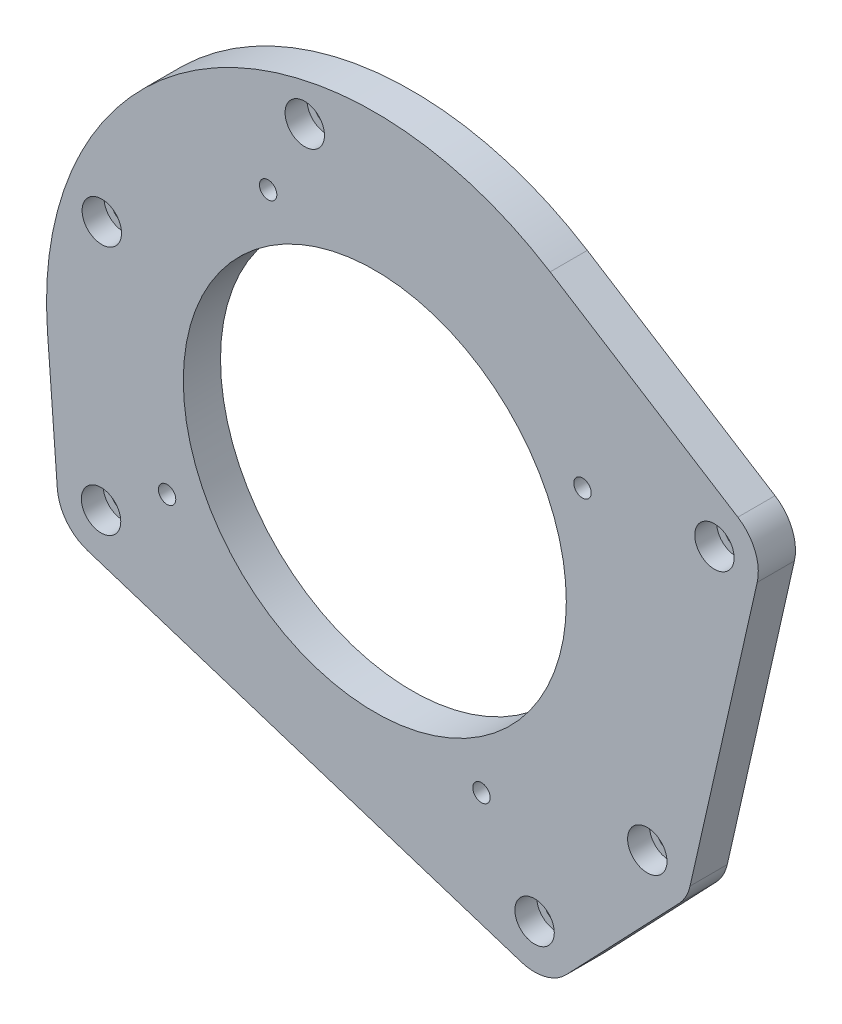
ISO-10303-21;
HEADER;
FILE_DESCRIPTION(('STEP AP214'),'2;1');
FILE_NAME('part.step','',(''),(''),'','','');
FILE_SCHEMA(('AUTOMOTIVE_DESIGN { 1 0 10303 214 1 1 1 1 }'));
ENDSEC;
DATA;
#1=APPLICATION_CONTEXT('core data for automotive mechanical design processes');
#2=APPLICATION_PROTOCOL_DEFINITION('international standard','automotive_design',2000,#1);
#3=PRODUCT_CONTEXT('',#1,'mechanical');
#4=PRODUCT('Part','Part','',(#3));
#5=PRODUCT_RELATED_PRODUCT_CATEGORY('part','',(#4));
#6=PRODUCT_DEFINITION_FORMATION('','',#4);
#7=PRODUCT_DEFINITION_CONTEXT('part definition',#1,'design');
#8=PRODUCT_DEFINITION('design','',#6,#7);
#9=PRODUCT_DEFINITION_SHAPE('','',#8);
#10=(LENGTH_UNIT() NAMED_UNIT(*) SI_UNIT(.MILLI.,.METRE.));
#11=(NAMED_UNIT(*) PLANE_ANGLE_UNIT() SI_UNIT($,.RADIAN.));
#12=(NAMED_UNIT(*) SI_UNIT($,.STERADIAN.) SOLID_ANGLE_UNIT());
#13=UNCERTAINTY_MEASURE_WITH_UNIT(LENGTH_MEASURE(1.E-05),#10,'distance_accuracy_value','');
#14=(GEOMETRIC_REPRESENTATION_CONTEXT(3) GLOBAL_UNCERTAINTY_ASSIGNED_CONTEXT((#13)) GLOBAL_UNIT_ASSIGNED_CONTEXT((#10,
#11,#12)) REPRESENTATION_CONTEXT('',''));
#15=CARTESIAN_POINT('',(0.,0.,0.));
#16=DIRECTION('',(0.,0.,1.));
#17=DIRECTION('',(1.,0.,0.));
#18=AXIS2_PLACEMENT_3D('',#15,#16,#17);
#19=CARTESIAN_POINT('',(119.470310769494,-114.064414744749,17.));
#20=DIRECTION('',(-0.723281238147046,0.690553582674419,0.));
#21=DIRECTION('',(-0.690553582674419,-0.723281238147046,0.));
#22=AXIS2_PLACEMENT_3D('',#19,#20,#21);
#23=PLANE('',#22);
#24=DIRECTION('',(0.690553582674419,0.723281238147046,0.));
#25=VECTOR('',#24,1.);
#26=CARTESIAN_POINT('',(119.470310769494,-114.064414744749,0.));
#27=LINE('',#26,#25);
#28=CARTESIAN_POINT('',(87.4941780013985,-147.556003927578,0.));
#29=VERTEX_POINT('',#28);
#30=CARTESIAN_POINT('',(138.99417800116,-93.6152458184964,0.));
#31=VERTEX_POINT('',#30);
#32=EDGE_CURVE('E148',#29,#31,#27,.T.);
#33=ORIENTED_EDGE('',*,*,#32,.T.);
#34=DIRECTION('',(0.,0.,-1.));
#35=VECTOR('',#34,1.);
#36=CARTESIAN_POINT('',(138.99417800116,-93.6152458184964,17.));
#37=LINE('',#36,#35);
#38=CARTESIAN_POINT('',(138.99417800116,-93.6152458184964,17.));
#39=VERTEX_POINT('',#38);
#40=EDGE_CURVE('E11',#39,#31,#37,.T.);
#41=ORIENTED_EDGE('',*,*,#40,.F.);
#42=DIRECTION('',(0.690553582674419,0.723281238147046,0.));
#43=VECTOR('',#42,1.);
#44=CARTESIAN_POINT('',(119.470310769494,-114.064414744749,17.));
#45=LINE('',#44,#43);
#46=CARTESIAN_POINT('',(87.4941780013985,-147.556003927578,17.));
#47=VERTEX_POINT('',#46);
#48=EDGE_CURVE('E220',#47,#39,#45,.T.);
#49=ORIENTED_EDGE('',*,*,#48,.F.);
#50=DIRECTION('',(0.,0.,-1.));
#51=VECTOR('',#50,1.);
#52=CARTESIAN_POINT('',(87.4941780013985,-147.556003927578,17.));
#53=LINE('',#52,#51);
#54=EDGE_CURVE('E141',#47,#29,#53,.T.);
#55=ORIENTED_EDGE('',*,*,#54,.T.);
#56=EDGE_LOOP('',(#33,#41,#49,#55));
#57=FACE_BOUND('',#56,.T.);
#58=ADVANCED_FACE('F37',(#57),#23,.F.);
#59=CARTESIAN_POINT('',(124.500000000623,-79.7769129290198,17.));
#60=DIRECTION('',(0.,0.,-1.));
#61=DIRECTION('',(-1.,0.,0.));
#62=AXIS2_PLACEMENT_3D('',#59,#60,#61);
#63=CYLINDRICAL_SURFACE('',#62,20.0394773652214);
#64=CARTESIAN_POINT('',(124.500000000623,-79.7769129290198,0.));
#65=DIRECTION('',(0.,0.,1.));
#66=DIRECTION('',(1.,0.,0.));
#67=AXIS2_PLACEMENT_3D('',#64,#65,#66);
#68=CIRCLE('',#67,20.0394773652214);
#69=CARTESIAN_POINT('',(144.044882633008,-84.2016407124546,0.));
#70=VERTEX_POINT('',#69);
#71=EDGE_CURVE('E152',#31,#70,#68,.T.);
#72=ORIENTED_EDGE('',*,*,#71,.T.);
#73=DIRECTION('',(0.,0.,-1.));
#74=VECTOR('',#73,1.);
#75=CARTESIAN_POINT('',(144.044882633008,-84.2016407124546,17.));
#76=LINE('',#75,#74);
#77=CARTESIAN_POINT('',(144.044882633008,-84.2016407124546,17.));
#78=VERTEX_POINT('',#77);
#79=EDGE_CURVE('E46',#78,#70,#76,.T.);
#80=ORIENTED_EDGE('',*,*,#79,.F.);
#81=CARTESIAN_POINT('',(124.500000000623,-79.7769129290198,17.));
#82=DIRECTION('',(0.,0.,1.));
#83=DIRECTION('',(1.,0.,0.));
#84=AXIS2_PLACEMENT_3D('',#81,#82,#83);
#85=CIRCLE('',#84,20.0394773652214);
#86=EDGE_CURVE('E103',#39,#78,#85,.T.);
#87=ORIENTED_EDGE('',*,*,#86,.F.);
#88=ORIENTED_EDGE('',*,*,#40,.T.);
#89=EDGE_LOOP('',(#72,#80,#87,#88));
#90=FACE_BOUND('',#89,.T.);
#91=ADVANCED_FACE('F190',(#90),#63,.T.);
#92=CARTESIAN_POINT('',(155.155184264045,-35.1252789525328,17.));
#93=DIRECTION('',(0.975318980439363,-0.220800557958355,0.));
#94=DIRECTION('',(0.220800557958355,0.975318980439363,0.));
#95=AXIS2_PLACEMENT_3D('',#92,#93,#94);
#96=PLANE('',#95);
#97=DIRECTION('',(-0.220800557958355,-0.975318980439363,0.));
#98=VECTOR('',#97,1.);
#99=CARTESIAN_POINT('',(155.155184264045,-35.1252789525328,0.));
#100=LINE('',#99,#98);
#101=CARTESIAN_POINT('',(174.718661168987,51.2904009950494,0.));
#102=VERTEX_POINT('',#101);
#103=EDGE_CURVE('E155',#102,#70,#100,.T.);
#104=ORIENTED_EDGE('',*,*,#103,.F.);
#105=DIRECTION('',(0.,0.,-1.));
#106=VECTOR('',#105,1.);
#107=CARTESIAN_POINT('',(174.718661168987,51.2904009950494,17.));
#108=LINE('',#107,#106);
#109=CARTESIAN_POINT('',(174.718661168987,51.2904009950494,17.));
#110=VERTEX_POINT('',#109);
#111=EDGE_CURVE('E183',#110,#102,#108,.T.);
#112=ORIENTED_EDGE('',*,*,#111,.F.);
#113=DIRECTION('',(-0.220800557958355,-0.975318980439363,0.));
#114=VECTOR('',#113,1.);
#115=CARTESIAN_POINT('',(155.155184264045,-35.1252789525328,17.));
#116=LINE('',#115,#114);
#117=EDGE_CURVE('E189',#110,#78,#116,.T.);
#118=ORIENTED_EDGE('',*,*,#117,.T.);
#119=ORIENTED_EDGE('',*,*,#79,.T.);
#120=EDGE_LOOP('',(#104,#112,#118,#119));
#121=FACE_BOUND('',#120,.T.);
#122=ADVANCED_FACE('F187',(#121),#96,.T.);
#123=CARTESIAN_POINT('',(155.173778536602,55.7151287784843,17.));
#124=DIRECTION('',(0.,0.,-1.));
#125=DIRECTION('',(-1.,0.,0.));
#126=AXIS2_PLACEMENT_3D('',#123,#124,#125);
#127=CYLINDRICAL_SURFACE('',#126,20.0394773652212);
#128=CARTESIAN_POINT('',(155.173778536602,55.7151287784843,0.));
#129=DIRECTION('',(0.,0.,1.));
#130=DIRECTION('',(1.,0.,0.));
#131=AXIS2_PLACEMENT_3D('',#128,#129,#130);
#132=CIRCLE('',#131,20.0394773652212);
#133=CARTESIAN_POINT('',(165.87343122716,72.6590977755238,0.));
#134=VERTEX_POINT('',#133);
#135=EDGE_CURVE('E158',#102,#134,#132,.T.);
#136=ORIENTED_EDGE('',*,*,#135,.T.);
#137=DIRECTION('',(0.,0.,-1.));
#138=VECTOR('',#137,1.);
#139=CARTESIAN_POINT('',(165.87343122716,72.6590977755238,17.));
#140=LINE('',#139,#138);
#141=CARTESIAN_POINT('',(165.87343122716,72.6590977755238,17.));
#142=VERTEX_POINT('',#141);
#143=EDGE_CURVE('E180',#142,#134,#140,.T.);
#144=ORIENTED_EDGE('',*,*,#143,.F.);
#145=CARTESIAN_POINT('',(155.173778536602,55.7151287784843,17.));
#146=DIRECTION('',(0.,0.,1.));
#147=DIRECTION('',(1.,0.,0.));
#148=AXIS2_PLACEMENT_3D('',#145,#146,#147);
#149=CIRCLE('',#148,20.0394773652212);
#150=EDGE_CURVE('E209',#110,#142,#149,.T.);
#151=ORIENTED_EDGE('',*,*,#150,.F.);
#152=ORIENTED_EDGE('',*,*,#111,.T.);
#153=EDGE_LOOP('',(#136,#144,#151,#152));
#154=FACE_BOUND('',#153,.T.);
#155=ADVANCED_FACE('F200',(#154),#127,.T.);
#156=CARTESIAN_POINT('',(80.0893094332477,126.829422905356,17.));
#157=DIRECTION('',(-0.533928729554984,-0.845529486035703,0.));
#158=DIRECTION('',(0.845529486035703,-0.533928729554984,0.));
#159=AXIS2_PLACEMENT_3D('',#156,#157,#158);
#160=PLANE('',#159);
#161=DIRECTION('',(-0.845529486035703,0.533928729554985,0.));
#162=VECTOR('',#161,1.);
#163=CARTESIAN_POINT('',(80.0893094332477,126.829422905356,0.));
#164=LINE('',#163,#162);
#165=CARTESIAN_POINT('',(80.0893094332478,126.829422905356,0.));
#166=VERTEX_POINT('',#165);
#167=EDGE_CURVE('E160',#134,#166,#164,.T.);
#168=ORIENTED_EDGE('',*,*,#167,.T.);
#169=DIRECTION('',(0.,0.,-1.));
#170=VECTOR('',#169,1.);
#171=CARTESIAN_POINT('',(80.0893094332478,126.829422905356,17.));
#172=LINE('',#171,#170);
#173=CARTESIAN_POINT('',(80.0893094332478,126.829422905356,17.));
#174=VERTEX_POINT('',#173);
#175=EDGE_CURVE('E177',#174,#166,#172,.T.);
#176=ORIENTED_EDGE('',*,*,#175,.F.);
#177=DIRECTION('',(-0.845529486035703,0.533928729554985,0.));
#178=VECTOR('',#177,1.);
#179=CARTESIAN_POINT('',(80.0893094332477,126.829422905356,17.));
#180=LINE('',#179,#178);
#181=EDGE_CURVE('E206',#142,#174,#180,.T.);
#182=ORIENTED_EDGE('',*,*,#181,.F.);
#183=ORIENTED_EDGE('',*,*,#143,.T.);
#184=EDGE_LOOP('',(#168,#176,#182,#183));
#185=FACE_BOUND('',#184,.T.);
#186=ADVANCED_FACE('F204',(#185),#160,.F.);
#187=CARTESIAN_POINT('',(1.00092271023011E-13,1.52643785721383E-13,17.));
#188=DIRECTION('',(0.,0.,-1.));
#189=DIRECTION('',(-1.,0.,0.));
#190=AXIS2_PLACEMENT_3D('',#187,#188,#189);
#191=CYLINDRICAL_SURFACE('',#190,150.);
#192=CARTESIAN_POINT('',(1.00092271023011E-13,1.52643785721383E-13,0.));
#193=DIRECTION('',(0.,0.,1.));
#194=DIRECTION('',(1.,0.,0.));
#195=AXIS2_PLACEMENT_3D('',#192,#193,#194);
#196=CIRCLE('',#195,150.);
#197=CARTESIAN_POINT('',(-149.578321741435,-11.239469071788,0.));
#198=VERTEX_POINT('',#197);
#199=EDGE_CURVE('E162',#166,#198,#196,.T.);
#200=ORIENTED_EDGE('',*,*,#199,.T.);
#201=DIRECTION('',(0.,0.,-1.));
#202=VECTOR('',#201,1.);
#203=CARTESIAN_POINT('',(-149.578321741435,-11.239469071788,17.));
#204=LINE('',#203,#202);
#205=CARTESIAN_POINT('',(-149.578321741435,-11.239469071788,17.));
#206=VERTEX_POINT('',#205);
#207=EDGE_CURVE('E175',#206,#198,#204,.T.);
#208=ORIENTED_EDGE('',*,*,#207,.F.);
#209=CARTESIAN_POINT('',(1.00092271023011E-13,1.52643785721383E-13,17.));
#210=DIRECTION('',(0.,0.,1.));
#211=DIRECTION('',(1.,0.,0.));
#212=AXIS2_PLACEMENT_3D('',#209,#210,#211);
#213=CIRCLE('',#212,150.);
#214=EDGE_CURVE('E208',#174,#206,#213,.T.);
#215=ORIENTED_EDGE('',*,*,#214,.F.);
#216=ORIENTED_EDGE('',*,*,#175,.T.);
#217=EDGE_LOOP('',(#200,#208,#215,#216));
#218=FACE_BOUND('',#217,.T.);
#219=ADVANCED_FACE('F245',(#218),#191,.T.);
#220=CARTESIAN_POINT('',(-149.578321741435,-11.2394690717881,17.));
#221=DIRECTION('',(-0.997188811609568,-0.0749297938119206,0.));
#222=DIRECTION('',(0.0749297938119206,-0.997188811609568,0.));
#223=AXIS2_PLACEMENT_3D('',#220,#221,#222);
#224=PLANE('',#223);
#225=DIRECTION('',(-0.0749297938119206,0.997188811609568,0.));
#226=VECTOR('',#225,1.);
#227=CARTESIAN_POINT('',(-149.578321741435,-11.2394690717881,0.));
#228=LINE('',#227,#226);
#229=CARTESIAN_POINT('',(-145.046651368306,-71.5483364007124,0.));
#230=VERTEX_POINT('',#229);
#231=EDGE_CURVE('E165',#230,#198,#228,.T.);
#232=ORIENTED_EDGE('',*,*,#231,.F.);
#233=DIRECTION('',(0.,0.,-1.));
#234=VECTOR('',#233,1.);
#235=CARTESIAN_POINT('',(-145.046651368306,-71.5483364007124,17.));
#236=LINE('',#235,#234);
#237=CARTESIAN_POINT('',(-145.046651368306,-71.5483364007124,17.));
#238=VERTEX_POINT('',#237);
#239=EDGE_CURVE('E136',#238,#230,#236,.T.);
#240=ORIENTED_EDGE('',*,*,#239,.F.);
#241=DIRECTION('',(-0.0749297938119206,0.997188811609568,0.));
#242=VECTOR('',#241,1.);
#243=CARTESIAN_POINT('',(-149.578321741435,-11.2394690717881,17.));
#244=LINE('',#243,#242);
#245=EDGE_CURVE('E129',#238,#206,#244,.T.);
#246=ORIENTED_EDGE('',*,*,#245,.T.);
#247=ORIENTED_EDGE('',*,*,#207,.T.);
#248=EDGE_LOOP('',(#232,#240,#246,#247));
#249=FACE_BOUND('',#248,.T.);
#250=ADVANCED_FACE('F216',(#249),#224,.T.);
#251=CARTESIAN_POINT('',(-125.063508749204,-70.0467824936377,17.));
#252=DIRECTION('',(0.,0.,-1.));
#253=DIRECTION('',(-1.,0.,0.));
#254=AXIS2_PLACEMENT_3D('',#251,#252,#253);
#255=CYLINDRICAL_SURFACE('',#254,20.0394773652213);
#256=CARTESIAN_POINT('',(-125.063508749204,-70.0467824936377,0.));
#257=DIRECTION('',(0.,0.,1.));
#258=DIRECTION('',(1.,0.,0.));
#259=AXIS2_PLACEMENT_3D('',#256,#257,#258);
#260=CIRCLE('',#259,20.0394773652213);
#261=CARTESIAN_POINT('',(-131.196437849904,-89.1247235176846,0.));
#262=VERTEX_POINT('',#261);
#263=EDGE_CURVE('E135',#230,#262,#260,.T.);
#264=ORIENTED_EDGE('',*,*,#263,.T.);
#265=DIRECTION('',(0.,0.,-1.));
#266=VECTOR('',#265,1.);
#267=CARTESIAN_POINT('',(-131.196437849904,-89.1247235176846,17.));
#268=LINE('',#267,#266);
#269=CARTESIAN_POINT('',(-131.196437849904,-89.1247235176846,17.));
#270=VERTEX_POINT('',#269);
#271=EDGE_CURVE('E132',#270,#262,#268,.T.);
#272=ORIENTED_EDGE('',*,*,#271,.F.);
#273=CARTESIAN_POINT('',(-125.063508749204,-70.0467824936377,17.));
#274=DIRECTION('',(0.,0.,1.));
#275=DIRECTION('',(1.,0.,0.));
#276=AXIS2_PLACEMENT_3D('',#273,#274,#275);
#277=CIRCLE('',#276,20.0394773652213);
#278=EDGE_CURVE('E123',#238,#270,#277,.T.);
#279=ORIENTED_EDGE('',*,*,#278,.F.);
#280=ORIENTED_EDGE('',*,*,#239,.T.);
#281=EDGE_LOOP('',(#264,#272,#279,#280));
#282=FACE_BOUND('',#281,.T.);
#283=ADVANCED_FACE('F133',(#282),#255,.T.);
#284=CARTESIAN_POINT('',(-38.2552959648493,-119.002236662349,17.));
#285=DIRECTION('',(0.306042367718795,0.952017893298794,0.));
#286=DIRECTION('',(-0.952017893298794,0.306042367718795,0.));
#287=AXIS2_PLACEMENT_3D('',#284,#285,#286);
#288=PLANE('',#287);
#289=DIRECTION('',(0.952017893298794,-0.306042367718795,0.));
#290=VECTOR('',#289,1.);
#291=CARTESIAN_POINT('',(-38.2552959648493,-119.002236662349,0.));
#292=LINE('',#291,#290);
#293=CARTESIAN_POINT('',(66.867070900162,-152.795612062148,0.));
#294=VERTEX_POINT('',#293);
#295=EDGE_CURVE('E89',#262,#294,#292,.T.);
#296=ORIENTED_EDGE('',*,*,#295,.T.);
#297=DIRECTION('',(0.,0.,-1.));
#298=VECTOR('',#297,1.);
#299=CARTESIAN_POINT('',(66.867070900162,-152.795612062148,17.));
#300=LINE('',#299,#298);
#301=CARTESIAN_POINT('',(66.867070900162,-152.795612062148,17.));
#302=VERTEX_POINT('',#301);
#303=EDGE_CURVE('E137',#302,#294,#300,.T.);
#304=ORIENTED_EDGE('',*,*,#303,.F.);
#305=DIRECTION('',(0.952017893298794,-0.306042367718795,0.));
#306=VECTOR('',#305,1.);
#307=CARTESIAN_POINT('',(-38.2552959648493,-119.002236662349,17.));
#308=LINE('',#307,#306);
#309=EDGE_CURVE('E127',#270,#302,#308,.T.);
#310=ORIENTED_EDGE('',*,*,#309,.F.);
#311=ORIENTED_EDGE('',*,*,#271,.T.);
#312=EDGE_LOOP('',(#296,#304,#310,#311));
#313=FACE_BOUND('',#312,.T.);
#314=ADVANCED_FACE('F139',(#313),#288,.F.);
#315=CARTESIAN_POINT('',(1.00092271023011E-13,1.52643785721383E-13,17.));
#316=DIRECTION('',(0.,0.,-1.));
#317=DIRECTION('',(-1.,0.,0.));
#318=AXIS2_PLACEMENT_3D('',#315,#316,#317);
#319=CYLINDRICAL_SURFACE('',#318,87.5);
#320=CARTESIAN_POINT('',(1.00092271023011E-13,1.52643785721383E-13,17.));
#321=DIRECTION('',(0.,0.,1.));
#322=DIRECTION('',(1.,0.,0.));
#323=AXIS2_PLACEMENT_3D('',#320,#321,#322);
#324=CIRCLE('',#323,87.5);
#325=CARTESIAN_POINT('',(87.5000000000001,1.52643785721383E-13,17.));
#326=VERTEX_POINT('',#325);
#327=EDGE_CURVE('E171',#326,#326,#324,.T.);
#328=ORIENTED_EDGE('',*,*,#327,.T.);
#329=EDGE_LOOP('',(#328));
#330=FACE_BOUND('',#329,.T.);
#331=CARTESIAN_POINT('',(1.00092271023011E-13,1.52643785721383E-13,0.));
#332=DIRECTION('',(0.,0.,1.));
#333=DIRECTION('',(1.,0.,0.));
#334=AXIS2_PLACEMENT_3D('',#331,#332,#333);
#335=CIRCLE('',#334,87.5);
#336=CARTESIAN_POINT('',(87.5000000000001,1.52643785721383E-13,0.));
#337=VERTEX_POINT('',#336);
#338=EDGE_CURVE('E145',#337,#337,#335,.T.);
#339=ORIENTED_EDGE('',*,*,#338,.F.);
#340=EDGE_LOOP('',(#339));
#341=FACE_BOUND('',#340,.T.);
#342=ADVANCED_FACE('F39',(#330,#341),#319,.F.);
#343=CARTESIAN_POINT('',(73.0000000008615,-133.717671038101,17.));
#344=DIRECTION('',(0.,0.,-1.));
#345=DIRECTION('',(-1.,0.,0.));
#346=AXIS2_PLACEMENT_3D('',#343,#344,#345);
#347=CYLINDRICAL_SURFACE('',#346,20.0394773652213);
#348=CARTESIAN_POINT('',(73.0000000008615,-133.717671038101,0.));
#349=DIRECTION('',(0.,0.,1.));
#350=DIRECTION('',(1.,0.,0.));
#351=AXIS2_PLACEMENT_3D('',#348,#349,#350);
#352=CIRCLE('',#351,20.0394773652213);
#353=EDGE_CURVE('E95',#294,#29,#352,.T.);
#354=ORIENTED_EDGE('',*,*,#353,.T.);
#355=ORIENTED_EDGE('',*,*,#54,.F.);
#356=CARTESIAN_POINT('',(73.0000000008615,-133.717671038101,17.));
#357=DIRECTION('',(0.,0.,1.));
#358=DIRECTION('',(1.,0.,0.));
#359=AXIS2_PLACEMENT_3D('',#356,#357,#358);
#360=CIRCLE('',#359,20.0394773652213);
#361=EDGE_CURVE('E54',#302,#47,#360,.T.);
#362=ORIENTED_EDGE('',*,*,#361,.F.);
#363=ORIENTED_EDGE('',*,*,#303,.T.);
#364=EDGE_LOOP('',(#354,#355,#362,#363));
#365=FACE_BOUND('',#364,.T.);
#366=ADVANCED_FACE('F221',(#365),#347,.T.);
#367=CARTESIAN_POINT('',(0.,0.,17.));
#368=DIRECTION('',(0.,0.,1.));
#369=DIRECTION('',(1.,0.,0.));
#370=AXIS2_PLACEMENT_3D('',#367,#368,#369);
#371=PLANE('',#370);
#372=CARTESIAN_POINT('',(-48.728615608265,94.9007082212808,17.));
#373=DIRECTION('',(0.,0.,1.));
#374=DIRECTION('',(1.,0.,0.));
#375=AXIS2_PLACEMENT_3D('',#372,#373,#374);
#376=CIRCLE('',#375,3.96874999999999);
#377=CARTESIAN_POINT('',(-44.759865608265,94.9007082212808,17.));
#378=VERTEX_POINT('',#377);
#379=EDGE_CURVE('E517',#378,#378,#376,.T.);
#380=ORIENTED_EDGE('',*,*,#379,.F.);
#381=EDGE_LOOP('',(#380));
#382=FACE_BOUND('',#381,.T.);
#383=CARTESIAN_POINT('',(94.9007082212915,48.7286156082705,17.));
#384=DIRECTION('',(0.,0.,1.));
#385=DIRECTION('',(1.,0.,0.));
#386=AXIS2_PLACEMENT_3D('',#383,#384,#385);
#387=CIRCLE('',#386,3.96874999999999);
#388=CARTESIAN_POINT('',(98.8694582212915,48.7286156082705,17.));
#389=VERTEX_POINT('',#388);
#390=EDGE_CURVE('E519',#389,#389,#387,.T.);
#391=ORIENTED_EDGE('',*,*,#390,.F.);
#392=EDGE_LOOP('',(#391));
#393=FACE_BOUND('',#392,.T.);
#394=CARTESIAN_POINT('',(48.7286156082812,-94.900708221286,17.));
#395=DIRECTION('',(0.,0.,1.));
#396=DIRECTION('',(1.,0.,0.));
#397=AXIS2_PLACEMENT_3D('',#394,#395,#396);
#398=CIRCLE('',#397,3.96874999999999);
#399=CARTESIAN_POINT('',(52.6973656082812,-94.900708221286,17.));
#400=VERTEX_POINT('',#399);
#401=EDGE_CURVE('E527',#400,#400,#398,.T.);
#402=ORIENTED_EDGE('',*,*,#401,.F.);
#403=EDGE_LOOP('',(#402));
#404=FACE_BOUND('',#403,.T.);
#405=CARTESIAN_POINT('',(-94.9007082212753,-48.7286156082757,17.));
#406=DIRECTION('',(0.,0.,1.));
#407=DIRECTION('',(1.,0.,0.));
#408=AXIS2_PLACEMENT_3D('',#405,#406,#407);
#409=CIRCLE('',#408,3.96874999999999);
#410=CARTESIAN_POINT('',(-90.9319582212753,-48.7286156082757,17.));
#411=VERTEX_POINT('',#410);
#412=EDGE_CURVE('E533',#411,#411,#409,.T.);
#413=ORIENTED_EDGE('',*,*,#412,.F.);
#414=EDGE_LOOP('',(#413));
#415=FACE_BOUND('',#414,.T.);
#416=CARTESIAN_POINT('',(-124.734461307801,44.2323684690552,17.));
#417=DIRECTION('',(0.,0.,1.));
#418=DIRECTION('',(1.,0.,0.));
#419=AXIS2_PLACEMENT_3D('',#416,#417,#418);
#420=CIRCLE('',#419,8.99999999999999);
#421=CARTESIAN_POINT('',(-115.734461307801,44.2323684690552,17.));
#422=VERTEX_POINT('',#421);
#423=EDGE_CURVE('E539',#422,#422,#420,.T.);
#424=ORIENTED_EDGE('',*,*,#423,.F.);
#425=EDGE_LOOP('',(#424));
#426=FACE_BOUND('',#425,.T.);
#427=CARTESIAN_POINT('',(-32.0000000002054,129.301071167028,17.));
#428=DIRECTION('',(0.,0.,1.));
#429=DIRECTION('',(1.,0.,0.));
#430=AXIS2_PLACEMENT_3D('',#427,#428,#429);
#431=CIRCLE('',#430,9.);
#432=CARTESIAN_POINT('',(-23.0000000002054,129.301071167028,17.));
#433=VERTEX_POINT('',#432);
#434=EDGE_CURVE('E551',#433,#433,#431,.T.);
#435=ORIENTED_EDGE('',*,*,#434,.F.);
#436=EDGE_LOOP('',(#435));
#437=FACE_BOUND('',#436,.T.);
#438=CARTESIAN_POINT('',(155.173778536602,55.7151287784843,17.));
#439=DIRECTION('',(0.,0.,1.));
#440=DIRECTION('',(1.,0.,0.));
#441=AXIS2_PLACEMENT_3D('',#438,#439,#440);
#442=CIRCLE('',#441,9.00000000000001);
#443=CARTESIAN_POINT('',(164.173778536602,55.7151287784843,17.));
#444=VERTEX_POINT('',#443);
#445=EDGE_CURVE('E563',#444,#444,#442,.T.);
#446=ORIENTED_EDGE('',*,*,#445,.F.);
#447=EDGE_LOOP('',(#446));
#448=FACE_BOUND('',#447,.T.);
#449=CARTESIAN_POINT('',(124.500000000623,-79.7769129290198,17.));
#450=DIRECTION('',(0.,0.,1.));
#451=DIRECTION('',(1.,0.,0.));
#452=AXIS2_PLACEMENT_3D('',#449,#450,#451);
#453=CIRCLE('',#452,9.00000000000001);
#454=CARTESIAN_POINT('',(133.500000000623,-79.7769129290198,17.));
#455=VERTEX_POINT('',#454);
#456=EDGE_CURVE('E575',#455,#455,#453,.T.);
#457=ORIENTED_EDGE('',*,*,#456,.F.);
#458=EDGE_LOOP('',(#457));
#459=FACE_BOUND('',#458,.T.);
#460=CARTESIAN_POINT('',(73.0000000008615,-133.717671038101,17.));
#461=DIRECTION('',(0.,0.,1.));
#462=DIRECTION('',(1.,0.,0.));
#463=AXIS2_PLACEMENT_3D('',#460,#461,#462);
#464=CIRCLE('',#463,8.99999999999999);
#465=CARTESIAN_POINT('',(82.0000000008615,-133.717671038101,17.));
#466=VERTEX_POINT('',#465);
#467=EDGE_CURVE('E587',#466,#466,#464,.T.);
#468=ORIENTED_EDGE('',*,*,#467,.F.);
#469=EDGE_LOOP('',(#468));
#470=FACE_BOUND('',#469,.T.);
#471=CARTESIAN_POINT('',(-125.063508749204,-70.0467824936377,17.));
#472=DIRECTION('',(0.,0.,1.));
#473=DIRECTION('',(1.,0.,0.));
#474=AXIS2_PLACEMENT_3D('',#471,#472,#473);
#475=CIRCLE('',#474,8.99999999999999);
#476=CARTESIAN_POINT('',(-116.063508749204,-70.0467824936377,17.));
#477=VERTEX_POINT('',#476);
#478=EDGE_CURVE('E599',#477,#477,#475,.T.);
#479=ORIENTED_EDGE('',*,*,#478,.F.);
#480=EDGE_LOOP('',(#479));
#481=FACE_BOUND('',#480,.T.);
#482=ORIENTED_EDGE('',*,*,#327,.F.);
#483=EDGE_LOOP('',(#482));
#484=FACE_BOUND('',#483,.T.);
#485=ORIENTED_EDGE('',*,*,#48,.T.);
#486=ORIENTED_EDGE('',*,*,#86,.T.);
#487=ORIENTED_EDGE('',*,*,#117,.F.);
#488=ORIENTED_EDGE('',*,*,#150,.T.);
#489=ORIENTED_EDGE('',*,*,#181,.T.);
#490=ORIENTED_EDGE('',*,*,#214,.T.);
#491=ORIENTED_EDGE('',*,*,#245,.F.);
#492=ORIENTED_EDGE('',*,*,#278,.T.);
#493=ORIENTED_EDGE('',*,*,#309,.T.);
#494=ORIENTED_EDGE('',*,*,#361,.T.);
#495=EDGE_LOOP('',(#485,#486,#487,#488,#489,#490,#491,#492,#493,#494));
#496=FACE_BOUND('',#495,.T.);
#497=ADVANCED_FACE('F125',(#382,#393,#404,#415,#426,#437,#448,#459,#470,#481,#484,#496),#371,.T.);
#498=CARTESIAN_POINT('',(0.,0.,0.));
#499=DIRECTION('',(0.,0.,1.));
#500=DIRECTION('',(1.,0.,0.));
#501=AXIS2_PLACEMENT_3D('',#498,#499,#500);
#502=PLANE('',#501);
#503=CARTESIAN_POINT('',(-48.728615608265,94.9007082212808,0.));
#504=DIRECTION('',(0.,0.,1.));
#505=DIRECTION('',(1.,0.,0.));
#506=AXIS2_PLACEMENT_3D('',#503,#504,#505);
#507=CIRCLE('',#506,3.96874999999999);
#508=CARTESIAN_POINT('',(-44.759865608265,94.9007082212808,0.));
#509=VERTEX_POINT('',#508);
#510=EDGE_CURVE('E514',#509,#509,#507,.T.);
#511=ORIENTED_EDGE('',*,*,#510,.T.);
#512=EDGE_LOOP('',(#511));
#513=FACE_BOUND('',#512,.T.);
#514=CARTESIAN_POINT('',(94.9007082212915,48.7286156082705,0.));
#515=DIRECTION('',(0.,0.,1.));
#516=DIRECTION('',(1.,0.,0.));
#517=AXIS2_PLACEMENT_3D('',#514,#515,#516);
#518=CIRCLE('',#517,3.96874999999999);
#519=CARTESIAN_POINT('',(98.8694582212915,48.7286156082705,0.));
#520=VERTEX_POINT('',#519);
#521=EDGE_CURVE('E524',#520,#520,#518,.T.);
#522=ORIENTED_EDGE('',*,*,#521,.T.);
#523=EDGE_LOOP('',(#522));
#524=FACE_BOUND('',#523,.T.);
#525=CARTESIAN_POINT('',(48.7286156082812,-94.900708221286,0.));
#526=DIRECTION('',(0.,0.,1.));
#527=DIRECTION('',(1.,0.,0.));
#528=AXIS2_PLACEMENT_3D('',#525,#526,#527);
#529=CIRCLE('',#528,3.96874999999999);
#530=CARTESIAN_POINT('',(52.6973656082812,-94.900708221286,0.));
#531=VERTEX_POINT('',#530);
#532=EDGE_CURVE('E530',#531,#531,#529,.T.);
#533=ORIENTED_EDGE('',*,*,#532,.T.);
#534=EDGE_LOOP('',(#533));
#535=FACE_BOUND('',#534,.T.);
#536=CARTESIAN_POINT('',(-94.9007082212753,-48.7286156082757,0.));
#537=DIRECTION('',(0.,0.,1.));
#538=DIRECTION('',(1.,0.,0.));
#539=AXIS2_PLACEMENT_3D('',#536,#537,#538);
#540=CIRCLE('',#539,3.96874999999999);
#541=CARTESIAN_POINT('',(-90.9319582212753,-48.7286156082757,0.));
#542=VERTEX_POINT('',#541);
#543=EDGE_CURVE('E536',#542,#542,#540,.T.);
#544=ORIENTED_EDGE('',*,*,#543,.T.);
#545=EDGE_LOOP('',(#544));
#546=FACE_BOUND('',#545,.T.);
#547=CARTESIAN_POINT('',(-124.734461307801,44.2323684690552,0.));
#548=DIRECTION('',(0.,0.,1.));
#549=DIRECTION('',(1.,0.,0.));
#550=AXIS2_PLACEMENT_3D('',#547,#548,#549);
#551=CIRCLE('',#550,5.49999999999999);
#552=CARTESIAN_POINT('',(-119.234461307801,44.2323684690552,0.));
#553=VERTEX_POINT('',#552);
#554=EDGE_CURVE('E548',#553,#553,#551,.T.);
#555=ORIENTED_EDGE('',*,*,#554,.T.);
#556=EDGE_LOOP('',(#555));
#557=FACE_BOUND('',#556,.T.);
#558=CARTESIAN_POINT('',(-32.0000000002054,129.301071167028,0.));
#559=DIRECTION('',(0.,0.,1.));
#560=DIRECTION('',(1.,0.,0.));
#561=AXIS2_PLACEMENT_3D('',#558,#559,#560);
#562=CIRCLE('',#561,5.5);
#563=CARTESIAN_POINT('',(-26.5000000002054,129.301071167028,0.));
#564=VERTEX_POINT('',#563);
#565=EDGE_CURVE('E560',#564,#564,#562,.T.);
#566=ORIENTED_EDGE('',*,*,#565,.T.);
#567=EDGE_LOOP('',(#566));
#568=FACE_BOUND('',#567,.T.);
#569=CARTESIAN_POINT('',(155.173778536602,55.7151287784843,0.));
#570=DIRECTION('',(0.,0.,1.));
#571=DIRECTION('',(1.,0.,0.));
#572=AXIS2_PLACEMENT_3D('',#569,#570,#571);
#573=CIRCLE('',#572,5.50000000000001);
#574=CARTESIAN_POINT('',(160.673778536602,55.7151287784843,0.));
#575=VERTEX_POINT('',#574);
#576=EDGE_CURVE('E572',#575,#575,#573,.T.);
#577=ORIENTED_EDGE('',*,*,#576,.T.);
#578=EDGE_LOOP('',(#577));
#579=FACE_BOUND('',#578,.T.);
#580=CARTESIAN_POINT('',(124.500000000623,-79.7769129290198,0.));
#581=DIRECTION('',(0.,0.,1.));
#582=DIRECTION('',(1.,0.,0.));
#583=AXIS2_PLACEMENT_3D('',#580,#581,#582);
#584=CIRCLE('',#583,5.50000000000001);
#585=CARTESIAN_POINT('',(130.000000000623,-79.7769129290198,0.));
#586=VERTEX_POINT('',#585);
#587=EDGE_CURVE('E584',#586,#586,#584,.T.);
#588=ORIENTED_EDGE('',*,*,#587,.T.);
#589=EDGE_LOOP('',(#588));
#590=FACE_BOUND('',#589,.T.);
#591=CARTESIAN_POINT('',(73.0000000008615,-133.717671038101,0.));
#592=DIRECTION('',(0.,0.,1.));
#593=DIRECTION('',(1.,0.,0.));
#594=AXIS2_PLACEMENT_3D('',#591,#592,#593);
#595=CIRCLE('',#594,5.49999999999999);
#596=CARTESIAN_POINT('',(78.5000000008615,-133.717671038101,0.));
#597=VERTEX_POINT('',#596);
#598=EDGE_CURVE('E596',#597,#597,#595,.T.);
#599=ORIENTED_EDGE('',*,*,#598,.T.);
#600=EDGE_LOOP('',(#599));
#601=FACE_BOUND('',#600,.T.);
#602=CARTESIAN_POINT('',(-125.063508749204,-70.0467824936377,0.));
#603=DIRECTION('',(0.,0.,1.));
#604=DIRECTION('',(1.,0.,0.));
#605=AXIS2_PLACEMENT_3D('',#602,#603,#604);
#606=CIRCLE('',#605,5.49999999999999);
#607=CARTESIAN_POINT('',(-119.563508749204,-70.0467824936377,0.));
#608=VERTEX_POINT('',#607);
#609=EDGE_CURVE('E149',#608,#608,#606,.T.);
#610=ORIENTED_EDGE('',*,*,#609,.T.);
#611=EDGE_LOOP('',(#610));
#612=FACE_BOUND('',#611,.T.);
#613=ORIENTED_EDGE('',*,*,#338,.T.);
#614=EDGE_LOOP('',(#613));
#615=FACE_BOUND('',#614,.T.);
#616=ORIENTED_EDGE('',*,*,#32,.F.);
#617=ORIENTED_EDGE('',*,*,#353,.F.);
#618=ORIENTED_EDGE('',*,*,#295,.F.);
#619=ORIENTED_EDGE('',*,*,#263,.F.);
#620=ORIENTED_EDGE('',*,*,#231,.T.);
#621=ORIENTED_EDGE('',*,*,#199,.F.);
#622=ORIENTED_EDGE('',*,*,#167,.F.);
#623=ORIENTED_EDGE('',*,*,#135,.F.);
#624=ORIENTED_EDGE('',*,*,#103,.T.);
#625=ORIENTED_EDGE('',*,*,#71,.F.);
#626=EDGE_LOOP('',(#616,#617,#618,#619,#620,#621,#622,#623,#624,#625));
#627=FACE_BOUND('',#626,.T.);
#628=ADVANCED_FACE('F195',(#513,#524,#535,#546,#557,#568,#579,#590,#601,#612,#615,#627),#502,.F.);
#629=CARTESIAN_POINT('',(-125.063508749204,-70.0467824936377,17.));
#630=DIRECTION('',(0.,0.,1.));
#631=DIRECTION('',(1.,0.,0.));
#632=AXIS2_PLACEMENT_3D('',#629,#630,#631);
#633=CYLINDRICAL_SURFACE('',#632,5.5);
#634=ORIENTED_EDGE('',*,*,#609,.F.);
#635=EDGE_LOOP('',(#634));
#636=FACE_BOUND('',#635,.T.);
#637=CARTESIAN_POINT('',(-125.063508749204,-70.0467824936377,7.));
#638=DIRECTION('',(0.,0.,1.));
#639=DIRECTION('',(1.,0.,0.));
#640=AXIS2_PLACEMENT_3D('',#637,#638,#639);
#641=CIRCLE('',#640,5.50000000000001);
#642=CARTESIAN_POINT('',(-119.563508749204,-70.0467824936377,7.));
#643=VERTEX_POINT('',#642);
#644=EDGE_CURVE('E605',#643,#643,#641,.T.);
#645=ORIENTED_EDGE('',*,*,#644,.T.);
#646=EDGE_LOOP('',(#645));
#647=FACE_BOUND('',#646,.T.);
#648=ADVANCED_FACE('F271',(#636,#647),#633,.F.);
#649=CARTESIAN_POINT('',(-119.563508749204,-70.0467824936377,7.));
#650=DIRECTION('',(0.,0.,-1.));
#651=DIRECTION('',(-1.,0.,0.));
#652=AXIS2_PLACEMENT_3D('',#649,#650,#651);
#653=PLANE('',#652);
#654=ORIENTED_EDGE('',*,*,#644,.F.);
#655=EDGE_LOOP('',(#654));
#656=FACE_BOUND('',#655,.T.);
#657=CARTESIAN_POINT('',(-125.063508749204,-70.0467824936377,7.));
#658=DIRECTION('',(0.,0.,1.));
#659=DIRECTION('',(1.,0.,0.));
#660=AXIS2_PLACEMENT_3D('',#657,#658,#659);
#661=CIRCLE('',#660,8.99999999999999);
#662=CARTESIAN_POINT('',(-116.063508749204,-70.0467824936377,7.));
#663=VERTEX_POINT('',#662);
#664=EDGE_CURVE('E602',#663,#663,#661,.T.);
#665=ORIENTED_EDGE('',*,*,#664,.T.);
#666=EDGE_LOOP('',(#665));
#667=FACE_BOUND('',#666,.T.);
#668=ADVANCED_FACE('F276',(#656,#667),#653,.F.);
#669=CARTESIAN_POINT('',(-125.063508749204,-70.0467824936377,17.));
#670=DIRECTION('',(0.,0.,1.));
#671=DIRECTION('',(1.,0.,0.));
#672=AXIS2_PLACEMENT_3D('',#669,#670,#671);
#673=CYLINDRICAL_SURFACE('',#672,8.99999999999999);
#674=ORIENTED_EDGE('',*,*,#664,.F.);
#675=EDGE_LOOP('',(#674));
#676=FACE_BOUND('',#675,.T.);
#677=ORIENTED_EDGE('',*,*,#478,.T.);
#678=EDGE_LOOP('',(#677));
#679=FACE_BOUND('',#678,.T.);
#680=ADVANCED_FACE('F288',(#676,#679),#673,.F.);
#681=CARTESIAN_POINT('',(73.0000000008615,-133.717671038101,17.));
#682=DIRECTION('',(0.,0.,1.));
#683=DIRECTION('',(1.,0.,0.));
#684=AXIS2_PLACEMENT_3D('',#681,#682,#683);
#685=CYLINDRICAL_SURFACE('',#684,5.5);
#686=ORIENTED_EDGE('',*,*,#598,.F.);
#687=EDGE_LOOP('',(#686));
#688=FACE_BOUND('',#687,.T.);
#689=CARTESIAN_POINT('',(73.0000000008615,-133.717671038101,7.));
#690=DIRECTION('',(0.,0.,1.));
#691=DIRECTION('',(1.,0.,0.));
#692=AXIS2_PLACEMENT_3D('',#689,#690,#691);
#693=CIRCLE('',#692,5.50000000000001);
#694=CARTESIAN_POINT('',(78.5000000008615,-133.717671038101,7.));
#695=VERTEX_POINT('',#694);
#696=EDGE_CURVE('E593',#695,#695,#693,.T.);
#697=ORIENTED_EDGE('',*,*,#696,.T.);
#698=EDGE_LOOP('',(#697));
#699=FACE_BOUND('',#698,.T.);
#700=ADVANCED_FACE('F298',(#688,#699),#685,.F.);
#701=CARTESIAN_POINT('',(78.5000000008615,-133.717671038101,7.));
#702=DIRECTION('',(0.,0.,-1.));
#703=DIRECTION('',(-1.,0.,0.));
#704=AXIS2_PLACEMENT_3D('',#701,#702,#703);
#705=PLANE('',#704);
#706=ORIENTED_EDGE('',*,*,#696,.F.);
#707=EDGE_LOOP('',(#706));
#708=FACE_BOUND('',#707,.T.);
#709=CARTESIAN_POINT('',(73.0000000008615,-133.717671038101,7.));
#710=DIRECTION('',(0.,0.,1.));
#711=DIRECTION('',(1.,0.,0.));
#712=AXIS2_PLACEMENT_3D('',#709,#710,#711);
#713=CIRCLE('',#712,8.99999999999999);
#714=CARTESIAN_POINT('',(82.0000000008615,-133.717671038101,7.));
#715=VERTEX_POINT('',#714);
#716=EDGE_CURVE('E590',#715,#715,#713,.T.);
#717=ORIENTED_EDGE('',*,*,#716,.T.);
#718=EDGE_LOOP('',(#717));
#719=FACE_BOUND('',#718,.T.);
#720=ADVANCED_FACE('F308',(#708,#719),#705,.F.);
#721=CARTESIAN_POINT('',(73.0000000008615,-133.717671038101,17.));
#722=DIRECTION('',(0.,0.,1.));
#723=DIRECTION('',(1.,0.,0.));
#724=AXIS2_PLACEMENT_3D('',#721,#722,#723);
#725=CYLINDRICAL_SURFACE('',#724,8.99999999999999);
#726=ORIENTED_EDGE('',*,*,#716,.F.);
#727=EDGE_LOOP('',(#726));
#728=FACE_BOUND('',#727,.T.);
#729=ORIENTED_EDGE('',*,*,#467,.T.);
#730=EDGE_LOOP('',(#729));
#731=FACE_BOUND('',#730,.T.);
#732=ADVANCED_FACE('F318',(#728,#731),#725,.F.);
#733=CARTESIAN_POINT('',(124.500000000623,-79.7769129290198,17.));
#734=DIRECTION('',(0.,0.,1.));
#735=DIRECTION('',(1.,0.,0.));
#736=AXIS2_PLACEMENT_3D('',#733,#734,#735);
#737=CYLINDRICAL_SURFACE('',#736,5.50000000000001);
#738=ORIENTED_EDGE('',*,*,#587,.F.);
#739=EDGE_LOOP('',(#738));
#740=FACE_BOUND('',#739,.T.);
#741=CARTESIAN_POINT('',(124.500000000623,-79.7769129290198,7.));
#742=DIRECTION('',(0.,0.,1.));
#743=DIRECTION('',(1.,0.,0.));
#744=AXIS2_PLACEMENT_3D('',#741,#742,#743);
#745=CIRCLE('',#744,5.50000000000001);
#746=CARTESIAN_POINT('',(130.000000000623,-79.7769129290198,7.));
#747=VERTEX_POINT('',#746);
#748=EDGE_CURVE('E581',#747,#747,#745,.T.);
#749=ORIENTED_EDGE('',*,*,#748,.T.);
#750=EDGE_LOOP('',(#749));
#751=FACE_BOUND('',#750,.T.);
#752=ADVANCED_FACE('F328',(#740,#751),#737,.F.);
#753=CARTESIAN_POINT('',(130.000000000623,-79.7769129290198,7.));
#754=DIRECTION('',(0.,0.,-1.));
#755=DIRECTION('',(-1.,0.,0.));
#756=AXIS2_PLACEMENT_3D('',#753,#754,#755);
#757=PLANE('',#756);
#758=ORIENTED_EDGE('',*,*,#748,.F.);
#759=EDGE_LOOP('',(#758));
#760=FACE_BOUND('',#759,.T.);
#761=CARTESIAN_POINT('',(124.500000000623,-79.7769129290198,7.));
#762=DIRECTION('',(0.,0.,1.));
#763=DIRECTION('',(1.,0.,0.));
#764=AXIS2_PLACEMENT_3D('',#761,#762,#763);
#765=CIRCLE('',#764,9.00000000000001);
#766=CARTESIAN_POINT('',(133.500000000623,-79.7769129290198,7.));
#767=VERTEX_POINT('',#766);
#768=EDGE_CURVE('E578',#767,#767,#765,.T.);
#769=ORIENTED_EDGE('',*,*,#768,.T.);
#770=EDGE_LOOP('',(#769));
#771=FACE_BOUND('',#770,.T.);
#772=ADVANCED_FACE('F338',(#760,#771),#757,.F.);
#773=CARTESIAN_POINT('',(124.500000000623,-79.7769129290198,17.));
#774=DIRECTION('',(0.,0.,1.));
#775=DIRECTION('',(1.,0.,0.));
#776=AXIS2_PLACEMENT_3D('',#773,#774,#775);
#777=CYLINDRICAL_SURFACE('',#776,9.00000000000001);
#778=ORIENTED_EDGE('',*,*,#768,.F.);
#779=EDGE_LOOP('',(#778));
#780=FACE_BOUND('',#779,.T.);
#781=ORIENTED_EDGE('',*,*,#456,.T.);
#782=EDGE_LOOP('',(#781));
#783=FACE_BOUND('',#782,.T.);
#784=ADVANCED_FACE('F348',(#780,#783),#777,.F.);
#785=CARTESIAN_POINT('',(155.173778536602,55.7151287784843,17.));
#786=DIRECTION('',(0.,0.,1.));
#787=DIRECTION('',(1.,0.,0.));
#788=AXIS2_PLACEMENT_3D('',#785,#786,#787);
#789=CYLINDRICAL_SURFACE('',#788,5.50000000000001);
#790=ORIENTED_EDGE('',*,*,#576,.F.);
#791=EDGE_LOOP('',(#790));
#792=FACE_BOUND('',#791,.T.);
#793=CARTESIAN_POINT('',(155.173778536602,55.7151287784843,7.));
#794=DIRECTION('',(0.,0.,1.));
#795=DIRECTION('',(1.,0.,0.));
#796=AXIS2_PLACEMENT_3D('',#793,#794,#795);
#797=CIRCLE('',#796,5.50000000000001);
#798=CARTESIAN_POINT('',(160.673778536602,55.7151287784843,7.));
#799=VERTEX_POINT('',#798);
#800=EDGE_CURVE('E569',#799,#799,#797,.T.);
#801=ORIENTED_EDGE('',*,*,#800,.T.);
#802=EDGE_LOOP('',(#801));
#803=FACE_BOUND('',#802,.T.);
#804=ADVANCED_FACE('F358',(#792,#803),#789,.F.);
#805=CARTESIAN_POINT('',(160.673778536602,55.7151287784843,7.));
#806=DIRECTION('',(0.,0.,-1.));
#807=DIRECTION('',(-1.,0.,0.));
#808=AXIS2_PLACEMENT_3D('',#805,#806,#807);
#809=PLANE('',#808);
#810=ORIENTED_EDGE('',*,*,#800,.F.);
#811=EDGE_LOOP('',(#810));
#812=FACE_BOUND('',#811,.T.);
#813=CARTESIAN_POINT('',(155.173778536602,55.7151287784843,7.));
#814=DIRECTION('',(0.,0.,1.));
#815=DIRECTION('',(1.,0.,0.));
#816=AXIS2_PLACEMENT_3D('',#813,#814,#815);
#817=CIRCLE('',#816,9.00000000000001);
#818=CARTESIAN_POINT('',(164.173778536602,55.7151287784843,7.));
#819=VERTEX_POINT('',#818);
#820=EDGE_CURVE('E566',#819,#819,#817,.T.);
#821=ORIENTED_EDGE('',*,*,#820,.T.);
#822=EDGE_LOOP('',(#821));
#823=FACE_BOUND('',#822,.T.);
#824=ADVANCED_FACE('F368',(#812,#823),#809,.F.);
#825=CARTESIAN_POINT('',(155.173778536602,55.7151287784843,17.));
#826=DIRECTION('',(0.,0.,1.));
#827=DIRECTION('',(1.,0.,0.));
#828=AXIS2_PLACEMENT_3D('',#825,#826,#827);
#829=CYLINDRICAL_SURFACE('',#828,9.00000000000001);
#830=ORIENTED_EDGE('',*,*,#820,.F.);
#831=EDGE_LOOP('',(#830));
#832=FACE_BOUND('',#831,.T.);
#833=ORIENTED_EDGE('',*,*,#445,.T.);
#834=EDGE_LOOP('',(#833));
#835=FACE_BOUND('',#834,.T.);
#836=ADVANCED_FACE('F378',(#832,#835),#829,.F.);
#837=CARTESIAN_POINT('',(-32.0000000002054,129.301071167028,17.));
#838=DIRECTION('',(0.,0.,1.));
#839=DIRECTION('',(1.,0.,0.));
#840=AXIS2_PLACEMENT_3D('',#837,#838,#839);
#841=CYLINDRICAL_SURFACE('',#840,5.5);
#842=ORIENTED_EDGE('',*,*,#565,.F.);
#843=EDGE_LOOP('',(#842));
#844=FACE_BOUND('',#843,.T.);
#845=CARTESIAN_POINT('',(-32.0000000002054,129.301071167028,7.));
#846=DIRECTION('',(0.,0.,1.));
#847=DIRECTION('',(1.,0.,0.));
#848=AXIS2_PLACEMENT_3D('',#845,#846,#847);
#849=CIRCLE('',#848,5.5);
#850=CARTESIAN_POINT('',(-26.5000000002054,129.301071167028,7.));
#851=VERTEX_POINT('',#850);
#852=EDGE_CURVE('E557',#851,#851,#849,.T.);
#853=ORIENTED_EDGE('',*,*,#852,.T.);
#854=EDGE_LOOP('',(#853));
#855=FACE_BOUND('',#854,.T.);
#856=ADVANCED_FACE('F388',(#844,#855),#841,.F.);
#857=CARTESIAN_POINT('',(-26.5000000002054,129.301071167028,7.));
#858=DIRECTION('',(0.,0.,-1.));
#859=DIRECTION('',(-1.,0.,0.));
#860=AXIS2_PLACEMENT_3D('',#857,#858,#859);
#861=PLANE('',#860);
#862=ORIENTED_EDGE('',*,*,#852,.F.);
#863=EDGE_LOOP('',(#862));
#864=FACE_BOUND('',#863,.T.);
#865=CARTESIAN_POINT('',(-32.0000000002054,129.301071167028,7.));
#866=DIRECTION('',(0.,0.,1.));
#867=DIRECTION('',(1.,0.,0.));
#868=AXIS2_PLACEMENT_3D('',#865,#866,#867);
#869=CIRCLE('',#868,9.);
#870=CARTESIAN_POINT('',(-23.0000000002054,129.301071167028,7.));
#871=VERTEX_POINT('',#870);
#872=EDGE_CURVE('E554',#871,#871,#869,.T.);
#873=ORIENTED_EDGE('',*,*,#872,.T.);
#874=EDGE_LOOP('',(#873));
#875=FACE_BOUND('',#874,.T.);
#876=ADVANCED_FACE('F398',(#864,#875),#861,.F.);
#877=CARTESIAN_POINT('',(-32.0000000002054,129.301071167028,17.));
#878=DIRECTION('',(0.,0.,1.));
#879=DIRECTION('',(1.,0.,0.));
#880=AXIS2_PLACEMENT_3D('',#877,#878,#879);
#881=CYLINDRICAL_SURFACE('',#880,9.);
#882=ORIENTED_EDGE('',*,*,#872,.F.);
#883=EDGE_LOOP('',(#882));
#884=FACE_BOUND('',#883,.T.);
#885=ORIENTED_EDGE('',*,*,#434,.T.);
#886=EDGE_LOOP('',(#885));
#887=FACE_BOUND('',#886,.T.);
#888=ADVANCED_FACE('F408',(#884,#887),#881,.F.);
#889=CARTESIAN_POINT('',(-124.734461307801,44.2323684690552,17.));
#890=DIRECTION('',(0.,0.,1.));
#891=DIRECTION('',(1.,0.,0.));
#892=AXIS2_PLACEMENT_3D('',#889,#890,#891);
#893=CYLINDRICAL_SURFACE('',#892,5.5);
#894=ORIENTED_EDGE('',*,*,#554,.F.);
#895=EDGE_LOOP('',(#894));
#896=FACE_BOUND('',#895,.T.);
#897=CARTESIAN_POINT('',(-124.734461307801,44.2323684690552,7.));
#898=DIRECTION('',(0.,0.,1.));
#899=DIRECTION('',(1.,0.,0.));
#900=AXIS2_PLACEMENT_3D('',#897,#898,#899);
#901=CIRCLE('',#900,5.50000000000001);
#902=CARTESIAN_POINT('',(-119.234461307801,44.2323684690552,7.));
#903=VERTEX_POINT('',#902);
#904=EDGE_CURVE('E545',#903,#903,#901,.T.);
#905=ORIENTED_EDGE('',*,*,#904,.T.);
#906=EDGE_LOOP('',(#905));
#907=FACE_BOUND('',#906,.T.);
#908=ADVANCED_FACE('F418',(#896,#907),#893,.F.);
#909=CARTESIAN_POINT('',(-119.234461307801,44.2323684690552,7.));
#910=DIRECTION('',(0.,0.,-1.));
#911=DIRECTION('',(-1.,0.,0.));
#912=AXIS2_PLACEMENT_3D('',#909,#910,#911);
#913=PLANE('',#912);
#914=ORIENTED_EDGE('',*,*,#904,.F.);
#915=EDGE_LOOP('',(#914));
#916=FACE_BOUND('',#915,.T.);
#917=CARTESIAN_POINT('',(-124.734461307801,44.2323684690552,7.));
#918=DIRECTION('',(0.,0.,1.));
#919=DIRECTION('',(1.,0.,0.));
#920=AXIS2_PLACEMENT_3D('',#917,#918,#919);
#921=CIRCLE('',#920,8.99999999999999);
#922=CARTESIAN_POINT('',(-115.734461307801,44.2323684690552,7.));
#923=VERTEX_POINT('',#922);
#924=EDGE_CURVE('E542',#923,#923,#921,.T.);
#925=ORIENTED_EDGE('',*,*,#924,.T.);
#926=EDGE_LOOP('',(#925));
#927=FACE_BOUND('',#926,.T.);
#928=ADVANCED_FACE('F428',(#916,#927),#913,.F.);
#929=CARTESIAN_POINT('',(-124.734461307801,44.2323684690552,17.));
#930=DIRECTION('',(0.,0.,1.));
#931=DIRECTION('',(1.,0.,0.));
#932=AXIS2_PLACEMENT_3D('',#929,#930,#931);
#933=CYLINDRICAL_SURFACE('',#932,8.99999999999999);
#934=ORIENTED_EDGE('',*,*,#924,.F.);
#935=EDGE_LOOP('',(#934));
#936=FACE_BOUND('',#935,.T.);
#937=ORIENTED_EDGE('',*,*,#423,.T.);
#938=EDGE_LOOP('',(#937));
#939=FACE_BOUND('',#938,.T.);
#940=ADVANCED_FACE('F438',(#936,#939),#933,.F.);
#941=CARTESIAN_POINT('',(-94.9007082212753,-48.7286156082757,17.));
#942=DIRECTION('',(0.,0.,1.));
#943=DIRECTION('',(1.,0.,0.));
#944=AXIS2_PLACEMENT_3D('',#941,#942,#943);
#945=CYLINDRICAL_SURFACE('',#944,3.96874999999999);
#946=ORIENTED_EDGE('',*,*,#543,.F.);
#947=EDGE_LOOP('',(#946));
#948=FACE_BOUND('',#947,.T.);
#949=ORIENTED_EDGE('',*,*,#412,.T.);
#950=EDGE_LOOP('',(#949));
#951=FACE_BOUND('',#950,.T.);
#952=ADVANCED_FACE('F448',(#948,#951),#945,.F.);
#953=CARTESIAN_POINT('',(48.7286156082812,-94.900708221286,17.));
#954=DIRECTION('',(0.,0.,1.));
#955=DIRECTION('',(1.,0.,0.));
#956=AXIS2_PLACEMENT_3D('',#953,#954,#955);
#957=CYLINDRICAL_SURFACE('',#956,3.96874999999999);
#958=ORIENTED_EDGE('',*,*,#532,.F.);
#959=EDGE_LOOP('',(#958));
#960=FACE_BOUND('',#959,.T.);
#961=ORIENTED_EDGE('',*,*,#401,.T.);
#962=EDGE_LOOP('',(#961));
#963=FACE_BOUND('',#962,.T.);
#964=ADVANCED_FACE('F470',(#960,#963),#957,.F.);
#965=CARTESIAN_POINT('',(94.9007082212915,48.7286156082705,17.));
#966=DIRECTION('',(0.,0.,1.));
#967=DIRECTION('',(1.,0.,0.));
#968=AXIS2_PLACEMENT_3D('',#965,#966,#967);
#969=CYLINDRICAL_SURFACE('',#968,3.96874999999999);
#970=ORIENTED_EDGE('',*,*,#521,.F.);
#971=EDGE_LOOP('',(#970));
#972=FACE_BOUND('',#971,.T.);
#973=ORIENTED_EDGE('',*,*,#390,.T.);
#974=EDGE_LOOP('',(#973));
#975=FACE_BOUND('',#974,.T.);
#976=ADVANCED_FACE('F481',(#972,#975),#969,.F.);
#977=CARTESIAN_POINT('',(-48.728615608265,94.9007082212808,17.));
#978=DIRECTION('',(0.,0.,1.));
#979=DIRECTION('',(1.,0.,0.));
#980=AXIS2_PLACEMENT_3D('',#977,#978,#979);
#981=CYLINDRICAL_SURFACE('',#980,3.96874999999999);
#982=ORIENTED_EDGE('',*,*,#510,.F.);
#983=EDGE_LOOP('',(#982));
#984=FACE_BOUND('',#983,.T.);
#985=ORIENTED_EDGE('',*,*,#379,.T.);
#986=EDGE_LOOP('',(#985));
#987=FACE_BOUND('',#986,.T.);
#988=ADVANCED_FACE('F492',(#984,#987),#981,.F.);
#989=CLOSED_SHELL('',(#58,#91,#122,#155,#186,#219,#250,#283,#314,#342,#366,#497,#628,#648,#668,
#680,#700,#720,#732,#752,#772,#784,#804,#824,#836,#856,#876,#888,#908,#928,#940,#952,#964,#976,#988));
#990=MANIFOLD_SOLID_BREP('B2',#989);
#991=ADVANCED_BREP_SHAPE_REPRESENTATION('',(#18,#990),#14);
#992=SHAPE_DEFINITION_REPRESENTATION(#9,#991);
ENDSEC;
END-ISO-10303-21;
